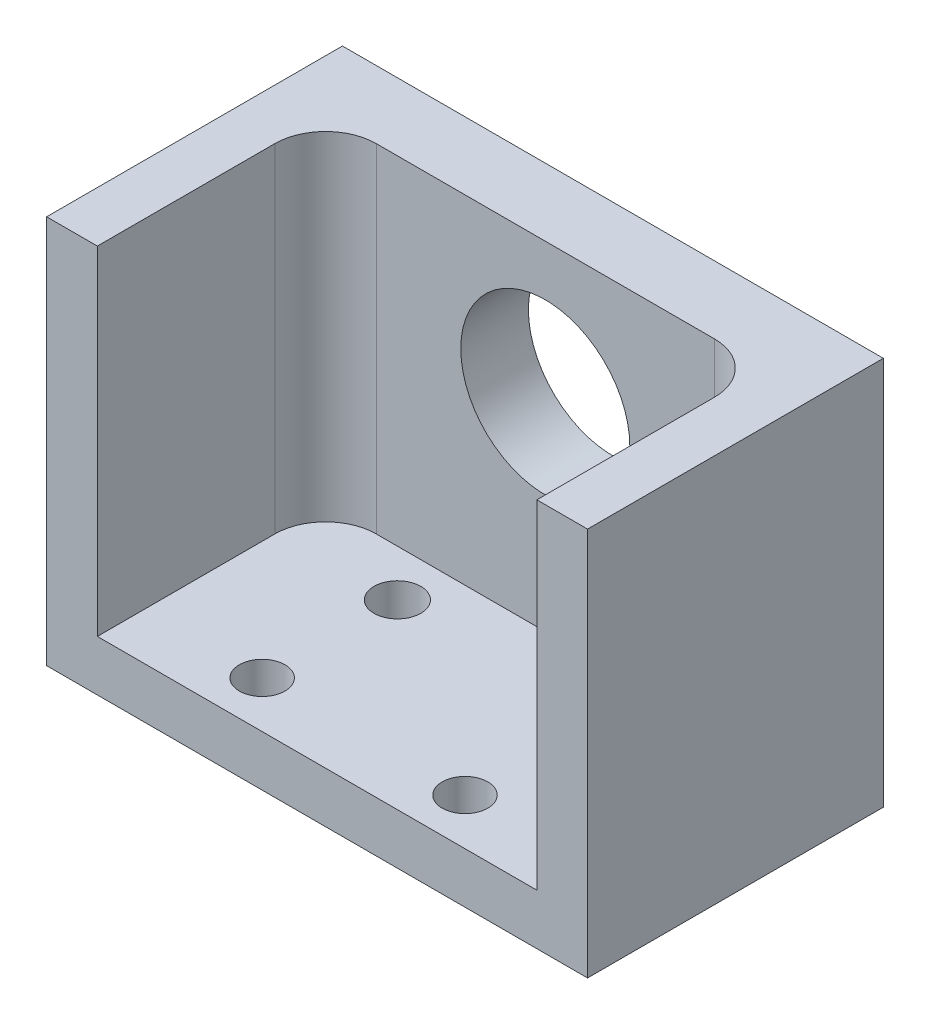
ISO-10303-21;
HEADER;
FILE_DESCRIPTION(('STEP AP214'),'2;1');
FILE_NAME('part.step','',(''),(''),'','','');
FILE_SCHEMA(('AUTOMOTIVE_DESIGN { 1 0 10303 214 1 1 1 1 }'));
ENDSEC;
DATA;
#1=APPLICATION_CONTEXT('core data for automotive mechanical design processes');
#2=APPLICATION_PROTOCOL_DEFINITION('international standard','automotive_design',2000,#1);
#3=PRODUCT_CONTEXT('',#1,'mechanical');
#4=PRODUCT('Part','Part','',(#3));
#5=PRODUCT_RELATED_PRODUCT_CATEGORY('part','',(#4));
#6=PRODUCT_DEFINITION_FORMATION('','',#4);
#7=PRODUCT_DEFINITION_CONTEXT('part definition',#1,'design');
#8=PRODUCT_DEFINITION('design','',#6,#7);
#9=PRODUCT_DEFINITION_SHAPE('','',#8);
#10=(LENGTH_UNIT() NAMED_UNIT(*) SI_UNIT(.MILLI.,.METRE.));
#11=(NAMED_UNIT(*) PLANE_ANGLE_UNIT() SI_UNIT($,.RADIAN.));
#12=(NAMED_UNIT(*) SI_UNIT($,.STERADIAN.) SOLID_ANGLE_UNIT());
#13=UNCERTAINTY_MEASURE_WITH_UNIT(LENGTH_MEASURE(1.E-05),#10,'distance_accuracy_value','');
#14=(GEOMETRIC_REPRESENTATION_CONTEXT(3) GLOBAL_UNCERTAINTY_ASSIGNED_CONTEXT((#13)) GLOBAL_UNIT_ASSIGNED_CONTEXT((#10,
#11,#12)) REPRESENTATION_CONTEXT('',''));
#15=CARTESIAN_POINT('',(0.,0.,0.));
#16=DIRECTION('',(0.,0.,1.));
#17=DIRECTION('',(1.,0.,0.));
#18=AXIS2_PLACEMENT_3D('',#15,#16,#17);
#19=CARTESIAN_POINT('',(0.,3.,0.));
#20=DIRECTION('',(0.,1.,0.));
#21=DIRECTION('',(0.,0.,1.));
#22=AXIS2_PLACEMENT_3D('',#19,#20,#21);
#23=PLANE('',#22);
#24=DIRECTION('',(1.,0.,0.));
#25=VECTOR('',#24,1.);
#26=CARTESIAN_POINT('',(-13.,3.,-4.75));
#27=LINE('',#26,#25);
#28=CARTESIAN_POINT('',(-10.,3.,-4.75));
#29=VERTEX_POINT('',#28);
#30=CARTESIAN_POINT('',(9.99999999999999,3.,-4.75));
#31=VERTEX_POINT('',#30);
#32=EDGE_CURVE('E171',#29,#31,#27,.T.);
#33=ORIENTED_EDGE('',*,*,#32,.F.);
#34=CARTESIAN_POINT('',(-10.,3.,-1.75));
#35=DIRECTION('',(0.,1.,0.));
#36=DIRECTION('',(0.,0.,1.));
#37=AXIS2_PLACEMENT_3D('',#34,#35,#36);
#38=CIRCLE('',#37,3.);
#39=CARTESIAN_POINT('',(-13.,3.,-1.75));
#40=VERTEX_POINT('',#39);
#41=EDGE_CURVE('E218',#29,#40,#38,.T.);
#42=ORIENTED_EDGE('',*,*,#41,.T.);
#43=DIRECTION('',(0.,0.,1.));
#44=VECTOR('',#43,1.);
#45=CARTESIAN_POINT('',(-13.,3.,-8.75));
#46=LINE('',#45,#44);
#47=CARTESIAN_POINT('',(-13.,3.,8.75));
#48=VERTEX_POINT('',#47);
#49=EDGE_CURVE('E204',#40,#48,#46,.T.);
#50=ORIENTED_EDGE('',*,*,#49,.T.);
#51=DIRECTION('',(1.,0.,0.));
#52=VECTOR('',#51,1.);
#53=CARTESIAN_POINT('',(-13.,3.,8.75));
#54=LINE('',#53,#52);
#55=CARTESIAN_POINT('',(13.,3.,8.75));
#56=VERTEX_POINT('',#55);
#57=EDGE_CURVE('E207',#48,#56,#54,.T.);
#58=ORIENTED_EDGE('',*,*,#57,.T.);
#59=DIRECTION('',(0.,0.,-1.));
#60=VECTOR('',#59,1.);
#61=CARTESIAN_POINT('',(13.,3.,-8.75));
#62=LINE('',#61,#60);
#63=CARTESIAN_POINT('',(13.,3.,-1.75));
#64=VERTEX_POINT('',#63);
#65=EDGE_CURVE('E135',#56,#64,#62,.T.);
#66=ORIENTED_EDGE('',*,*,#65,.T.);
#67=CARTESIAN_POINT('',(10.,3.,-1.75));
#68=DIRECTION('',(0.,1.,0.));
#69=DIRECTION('',(0.,0.,1.));
#70=AXIS2_PLACEMENT_3D('',#67,#68,#69);
#71=CIRCLE('',#70,3.);
#72=EDGE_CURVE('E216',#64,#31,#71,.T.);
#73=ORIENTED_EDGE('',*,*,#72,.T.);
#74=EDGE_LOOP('',(#33,#42,#50,#58,#66,#73));
#75=FACE_BOUND('',#74,.T.);
#76=CARTESIAN_POINT('',(6.,3.,-2.));
#77=DIRECTION('',(0.,1.,0.));
#78=DIRECTION('',(0.,0.,1.));
#79=AXIS2_PLACEMENT_3D('',#76,#77,#78);
#80=CIRCLE('',#79,1.35);
#81=CARTESIAN_POINT('',(6.,3.,-0.65));
#82=VERTEX_POINT('',#81);
#83=EDGE_CURVE('E185',#82,#82,#80,.T.);
#84=ORIENTED_EDGE('',*,*,#83,.F.);
#85=EDGE_LOOP('',(#84));
#86=FACE_BOUND('',#85,.T.);
#87=CARTESIAN_POINT('',(-6.,3.,6.));
#88=DIRECTION('',(0.,1.,0.));
#89=DIRECTION('',(0.,0.,1.));
#90=AXIS2_PLACEMENT_3D('',#87,#88,#89);
#91=CIRCLE('',#90,1.35);
#92=CARTESIAN_POINT('',(-6.,3.,7.35));
#93=VERTEX_POINT('',#92);
#94=EDGE_CURVE('E197',#93,#93,#91,.T.);
#95=ORIENTED_EDGE('',*,*,#94,.F.);
#96=EDGE_LOOP('',(#95));
#97=FACE_BOUND('',#96,.T.);
#98=CARTESIAN_POINT('',(-6.,3.,-2.));
#99=DIRECTION('',(0.,1.,0.));
#100=DIRECTION('',(0.,0.,1.));
#101=AXIS2_PLACEMENT_3D('',#98,#99,#100);
#102=CIRCLE('',#101,1.385);
#103=CARTESIAN_POINT('',(-6.,3.,-0.615));
#104=VERTEX_POINT('',#103);
#105=EDGE_CURVE('E191',#104,#104,#102,.T.);
#106=ORIENTED_EDGE('',*,*,#105,.F.);
#107=EDGE_LOOP('',(#106));
#108=FACE_BOUND('',#107,.T.);
#109=CARTESIAN_POINT('',(6.,3.,6.));
#110=DIRECTION('',(0.,1.,0.));
#111=DIRECTION('',(0.,0.,1.));
#112=AXIS2_PLACEMENT_3D('',#109,#110,#111);
#113=CIRCLE('',#112,1.35);
#114=CARTESIAN_POINT('',(6.,3.,7.35));
#115=VERTEX_POINT('',#114);
#116=EDGE_CURVE('E179',#115,#115,#113,.T.);
#117=ORIENTED_EDGE('',*,*,#116,.F.);
#118=EDGE_LOOP('',(#117));
#119=FACE_BOUND('',#118,.T.);
#120=ADVANCED_FACE('F36',(#75,#86,#97,#108,#119),#23,.T.);
#121=CARTESIAN_POINT('',(0.,0.,0.));
#122=DIRECTION('',(0.,1.,0.));
#123=DIRECTION('',(0.,0.,1.));
#124=AXIS2_PLACEMENT_3D('',#121,#122,#123);
#125=PLANE('',#124);
#126=DIRECTION('',(-1.,0.,0.));
#127=VECTOR('',#126,1.);
#128=CARTESIAN_POINT('',(-13.,0.,-8.75));
#129=LINE('',#128,#127);
#130=CARTESIAN_POINT('',(16.,0.,-8.75));
#131=VERTEX_POINT('',#130);
#132=CARTESIAN_POINT('',(-16.,0.,-8.75));
#133=VERTEX_POINT('',#132);
#134=EDGE_CURVE('E200',#131,#133,#129,.T.);
#135=ORIENTED_EDGE('',*,*,#134,.F.);
#136=DIRECTION('',(0.,0.,-1.));
#137=VECTOR('',#136,1.);
#138=CARTESIAN_POINT('',(16.,0.,-8.75));
#139=LINE('',#138,#137);
#140=CARTESIAN_POINT('',(16.,0.,8.75));
#141=VERTEX_POINT('',#140);
#142=EDGE_CURVE('E151',#141,#131,#139,.T.);
#143=ORIENTED_EDGE('',*,*,#142,.F.);
#144=DIRECTION('',(1.,0.,0.));
#145=VECTOR('',#144,1.);
#146=CARTESIAN_POINT('',(-13.,0.,8.75));
#147=LINE('',#146,#145);
#148=CARTESIAN_POINT('',(-16.,0.,8.75));
#149=VERTEX_POINT('',#148);
#150=EDGE_CURVE('E205',#149,#141,#147,.T.);
#151=ORIENTED_EDGE('',*,*,#150,.F.);
#152=DIRECTION('',(0.,0.,1.));
#153=VECTOR('',#152,1.);
#154=CARTESIAN_POINT('',(-16.,0.,-8.75));
#155=LINE('',#154,#153);
#156=EDGE_CURVE('E160',#133,#149,#155,.T.);
#157=ORIENTED_EDGE('',*,*,#156,.F.);
#158=EDGE_LOOP('',(#135,#143,#151,#157));
#159=FACE_BOUND('',#158,.T.);
#160=CARTESIAN_POINT('',(-6.,0.,6.));
#161=DIRECTION('',(0.,1.,0.));
#162=DIRECTION('',(0.,0.,1.));
#163=AXIS2_PLACEMENT_3D('',#160,#161,#162);
#164=CIRCLE('',#163,1.35);
#165=CARTESIAN_POINT('',(-6.,0.,7.35));
#166=VERTEX_POINT('',#165);
#167=EDGE_CURVE('E194',#166,#166,#164,.T.);
#168=ORIENTED_EDGE('',*,*,#167,.T.);
#169=EDGE_LOOP('',(#168));
#170=FACE_BOUND('',#169,.T.);
#171=CARTESIAN_POINT('',(-6.,0.,-2.));
#172=DIRECTION('',(0.,1.,0.));
#173=DIRECTION('',(0.,0.,1.));
#174=AXIS2_PLACEMENT_3D('',#171,#172,#173);
#175=CIRCLE('',#174,1.385);
#176=CARTESIAN_POINT('',(-6.,0.,-0.615));
#177=VERTEX_POINT('',#176);
#178=EDGE_CURVE('E188',#177,#177,#175,.T.);
#179=ORIENTED_EDGE('',*,*,#178,.T.);
#180=EDGE_LOOP('',(#179));
#181=FACE_BOUND('',#180,.T.);
#182=CARTESIAN_POINT('',(6.,0.,-2.));
#183=DIRECTION('',(0.,1.,0.));
#184=DIRECTION('',(0.,0.,1.));
#185=AXIS2_PLACEMENT_3D('',#182,#183,#184);
#186=CIRCLE('',#185,1.35);
#187=CARTESIAN_POINT('',(6.,0.,-0.65));
#188=VERTEX_POINT('',#187);
#189=EDGE_CURVE('E182',#188,#188,#186,.T.);
#190=ORIENTED_EDGE('',*,*,#189,.T.);
#191=EDGE_LOOP('',(#190));
#192=FACE_BOUND('',#191,.T.);
#193=CARTESIAN_POINT('',(6.,0.,6.));
#194=DIRECTION('',(0.,1.,0.));
#195=DIRECTION('',(0.,0.,1.));
#196=AXIS2_PLACEMENT_3D('',#193,#194,#195);
#197=CIRCLE('',#196,1.35);
#198=CARTESIAN_POINT('',(6.,0.,7.35));
#199=VERTEX_POINT('',#198);
#200=EDGE_CURVE('E176',#199,#199,#197,.T.);
#201=ORIENTED_EDGE('',*,*,#200,.T.);
#202=EDGE_LOOP('',(#201));
#203=FACE_BOUND('',#202,.T.);
#204=ADVANCED_FACE('F242',(#159,#170,#181,#192,#203),#125,.F.);
#205=CARTESIAN_POINT('',(-13.,3.,-8.75));
#206=DIRECTION('',(0.,0.,1.));
#207=DIRECTION('',(1.,0.,0.));
#208=AXIS2_PLACEMENT_3D('',#205,#206,#207);
#209=PLANE('',#208);
#210=CARTESIAN_POINT('',(0.,15.,-8.75));
#211=DIRECTION('',(0.,0.,1.));
#212=DIRECTION('',(1.,0.,0.));
#213=AXIS2_PLACEMENT_3D('',#210,#211,#212);
#214=CIRCLE('',#213,5.);
#215=CARTESIAN_POINT('',(5.,15.,-8.75));
#216=VERTEX_POINT('',#215);
#217=EDGE_CURVE('E168',#216,#216,#214,.T.);
#218=ORIENTED_EDGE('',*,*,#217,.T.);
#219=EDGE_LOOP('',(#218));
#220=FACE_BOUND('',#219,.T.);
#221=ORIENTED_EDGE('',*,*,#134,.T.);
#222=DIRECTION('',(0.,-1.,0.));
#223=VECTOR('',#222,1.);
#224=CARTESIAN_POINT('',(-16.,23.,-8.75));
#225=LINE('',#224,#223);
#226=CARTESIAN_POINT('',(-16.,23.,-8.75));
#227=VERTEX_POINT('',#226);
#228=EDGE_CURVE('E157',#227,#133,#225,.T.);
#229=ORIENTED_EDGE('',*,*,#228,.F.);
#230=DIRECTION('',(-1.,0.,0.));
#231=VECTOR('',#230,1.);
#232=CARTESIAN_POINT('',(-13.,23.,-8.75));
#233=LINE('',#232,#231);
#234=CARTESIAN_POINT('',(16.,23.,-8.75));
#235=VERTEX_POINT('',#234);
#236=EDGE_CURVE('E174',#235,#227,#233,.T.);
#237=ORIENTED_EDGE('',*,*,#236,.F.);
#238=DIRECTION('',(0.,1.,0.));
#239=VECTOR('',#238,1.);
#240=CARTESIAN_POINT('',(16.,23.,-8.75));
#241=LINE('',#240,#239);
#242=EDGE_CURVE('E145',#131,#235,#241,.T.);
#243=ORIENTED_EDGE('',*,*,#242,.F.);
#244=EDGE_LOOP('',(#221,#229,#237,#243));
#245=FACE_BOUND('',#244,.T.);
#246=ADVANCED_FACE('F249',(#220,#245),#209,.F.);
#247=CARTESIAN_POINT('',(-13.,3.,8.75));
#248=DIRECTION('',(0.,0.,-1.));
#249=DIRECTION('',(-1.,0.,0.));
#250=AXIS2_PLACEMENT_3D('',#247,#248,#249);
#251=PLANE('',#250);
#252=ORIENTED_EDGE('',*,*,#150,.T.);
#253=DIRECTION('',(0.,-1.,0.));
#254=VECTOR('',#253,1.);
#255=CARTESIAN_POINT('',(16.,0.,8.75));
#256=LINE('',#255,#254);
#257=CARTESIAN_POINT('',(16.,23.,8.75));
#258=VERTEX_POINT('',#257);
#259=EDGE_CURVE('E129',#258,#141,#256,.T.);
#260=ORIENTED_EDGE('',*,*,#259,.F.);
#261=DIRECTION('',(1.,0.,0.));
#262=VECTOR('',#261,1.);
#263=CARTESIAN_POINT('',(13.,23.,8.75));
#264=LINE('',#263,#262);
#265=CARTESIAN_POINT('',(13.,23.,8.75));
#266=VERTEX_POINT('',#265);
#267=EDGE_CURVE('E116',#266,#258,#264,.T.);
#268=ORIENTED_EDGE('',*,*,#267,.F.);
#269=DIRECTION('',(0.,-1.,0.));
#270=VECTOR('',#269,1.);
#271=CARTESIAN_POINT('',(13.,3.,8.75));
#272=LINE('',#271,#270);
#273=EDGE_CURVE('E121',#266,#56,#272,.T.);
#274=ORIENTED_EDGE('',*,*,#273,.T.);
#275=ORIENTED_EDGE('',*,*,#57,.F.);
#276=DIRECTION('',(0.,1.,0.));
#277=VECTOR('',#276,1.);
#278=CARTESIAN_POINT('',(-13.,23.,8.75));
#279=LINE('',#278,#277);
#280=CARTESIAN_POINT('',(-13.,23.,8.75));
#281=VERTEX_POINT('',#280);
#282=EDGE_CURVE('E130',#48,#281,#279,.T.);
#283=ORIENTED_EDGE('',*,*,#282,.T.);
#284=DIRECTION('',(-1.,0.,0.));
#285=VECTOR('',#284,1.);
#286=CARTESIAN_POINT('',(-13.,23.,8.75));
#287=LINE('',#286,#285);
#288=CARTESIAN_POINT('',(-16.,23.,8.75));
#289=VERTEX_POINT('',#288);
#290=EDGE_CURVE('E142',#281,#289,#287,.T.);
#291=ORIENTED_EDGE('',*,*,#290,.T.);
#292=DIRECTION('',(0.,1.,0.));
#293=VECTOR('',#292,1.);
#294=CARTESIAN_POINT('',(-16.,0.,8.75));
#295=LINE('',#294,#293);
#296=EDGE_CURVE('E163',#149,#289,#295,.T.);
#297=ORIENTED_EDGE('',*,*,#296,.F.);
#298=EDGE_LOOP('',(#252,#260,#268,#274,#275,#283,#291,#297));
#299=FACE_BOUND('',#298,.T.);
#300=ADVANCED_FACE('F126',(#299),#251,.F.);
#301=CARTESIAN_POINT('',(-6.,3.,6.));
#302=DIRECTION('',(0.,-1.,0.));
#303=DIRECTION('',(0.,0.,-1.));
#304=AXIS2_PLACEMENT_3D('',#301,#302,#303);
#305=CYLINDRICAL_SURFACE('',#304,1.35);
#306=ORIENTED_EDGE('',*,*,#94,.T.);
#307=EDGE_LOOP('',(#306));
#308=FACE_BOUND('',#307,.T.);
#309=ORIENTED_EDGE('',*,*,#167,.F.);
#310=EDGE_LOOP('',(#309));
#311=FACE_BOUND('',#310,.T.);
#312=ADVANCED_FACE('F253',(#308,#311),#305,.F.);
#313=CARTESIAN_POINT('',(-6.,3.,-2.));
#314=DIRECTION('',(0.,-1.,0.));
#315=DIRECTION('',(0.,0.,-1.));
#316=AXIS2_PLACEMENT_3D('',#313,#314,#315);
#317=CYLINDRICAL_SURFACE('',#316,1.385);
#318=ORIENTED_EDGE('',*,*,#105,.T.);
#319=EDGE_LOOP('',(#318));
#320=FACE_BOUND('',#319,.T.);
#321=ORIENTED_EDGE('',*,*,#178,.F.);
#322=EDGE_LOOP('',(#321));
#323=FACE_BOUND('',#322,.T.);
#324=ADVANCED_FACE('F300',(#320,#323),#317,.F.);
#325=CARTESIAN_POINT('',(6.,3.,-2.));
#326=DIRECTION('',(0.,-1.,0.));
#327=DIRECTION('',(0.,0.,-1.));
#328=AXIS2_PLACEMENT_3D('',#325,#326,#327);
#329=CYLINDRICAL_SURFACE('',#328,1.35);
#330=ORIENTED_EDGE('',*,*,#83,.T.);
#331=EDGE_LOOP('',(#330));
#332=FACE_BOUND('',#331,.T.);
#333=ORIENTED_EDGE('',*,*,#189,.F.);
#334=EDGE_LOOP('',(#333));
#335=FACE_BOUND('',#334,.T.);
#336=ADVANCED_FACE('F297',(#332,#335),#329,.F.);
#337=CARTESIAN_POINT('',(6.,3.,6.));
#338=DIRECTION('',(0.,-1.,0.));
#339=DIRECTION('',(0.,0.,-1.));
#340=AXIS2_PLACEMENT_3D('',#337,#338,#339);
#341=CYLINDRICAL_SURFACE('',#340,1.35);
#342=ORIENTED_EDGE('',*,*,#116,.T.);
#343=EDGE_LOOP('',(#342));
#344=FACE_BOUND('',#343,.T.);
#345=ORIENTED_EDGE('',*,*,#200,.F.);
#346=EDGE_LOOP('',(#345));
#347=FACE_BOUND('',#346,.T.);
#348=ADVANCED_FACE('F293',(#344,#347),#341,.F.);
#349=CARTESIAN_POINT('',(-13.,23.,-4.75));
#350=DIRECTION('',(0.,0.,-1.));
#351=DIRECTION('',(-1.,0.,0.));
#352=AXIS2_PLACEMENT_3D('',#349,#350,#351);
#353=PLANE('',#352);
#354=CARTESIAN_POINT('',(0.,15.,-4.75));
#355=DIRECTION('',(0.,0.,1.));
#356=DIRECTION('',(1.,0.,0.));
#357=AXIS2_PLACEMENT_3D('',#354,#355,#356);
#358=CIRCLE('',#357,5.);
#359=CARTESIAN_POINT('',(5.,15.,-4.75));
#360=VERTEX_POINT('',#359);
#361=EDGE_CURVE('E165',#360,#360,#358,.T.);
#362=ORIENTED_EDGE('',*,*,#361,.F.);
#363=EDGE_LOOP('',(#362));
#364=FACE_BOUND('',#363,.T.);
#365=DIRECTION('',(1.,0.,0.));
#366=VECTOR('',#365,1.);
#367=CARTESIAN_POINT('',(-13.,23.,-4.75));
#368=LINE('',#367,#366);
#369=CARTESIAN_POINT('',(-10.,23.,-4.75));
#370=VERTEX_POINT('',#369);
#371=CARTESIAN_POINT('',(9.99999999999999,23.,-4.75));
#372=VERTEX_POINT('',#371);
#373=EDGE_CURVE('E172',#370,#372,#368,.T.);
#374=ORIENTED_EDGE('',*,*,#373,.F.);
#375=DIRECTION('',(0.,-1.,0.));
#376=VECTOR('',#375,1.);
#377=CARTESIAN_POINT('',(-10.,3.,-4.75));
#378=LINE('',#377,#376);
#379=EDGE_CURVE('E213',#370,#29,#378,.T.);
#380=ORIENTED_EDGE('',*,*,#379,.T.);
#381=ORIENTED_EDGE('',*,*,#32,.T.);
#382=DIRECTION('',(0.,-1.,0.));
#383=VECTOR('',#382,1.);
#384=CARTESIAN_POINT('',(10.,23.,-4.75));
#385=LINE('',#384,#383);
#386=EDGE_CURVE('E209',#31,#372,#385,.F.);
#387=ORIENTED_EDGE('',*,*,#386,.T.);
#388=EDGE_LOOP('',(#374,#380,#381,#387));
#389=FACE_BOUND('',#388,.T.);
#390=ADVANCED_FACE('F227',(#364,#389),#353,.F.);
#391=CARTESIAN_POINT('',(0.,23.,0.));
#392=DIRECTION('',(0.,1.,0.));
#393=DIRECTION('',(0.,0.,1.));
#394=AXIS2_PLACEMENT_3D('',#391,#392,#393);
#395=PLANE('',#394);
#396=ORIENTED_EDGE('',*,*,#236,.T.);
#397=DIRECTION('',(0.,0.,-1.));
#398=VECTOR('',#397,1.);
#399=CARTESIAN_POINT('',(-16.,23.,-4.75));
#400=LINE('',#399,#398);
#401=EDGE_CURVE('E154',#289,#227,#400,.T.);
#402=ORIENTED_EDGE('',*,*,#401,.F.);
#403=ORIENTED_EDGE('',*,*,#290,.F.);
#404=DIRECTION('',(0.,0.,-1.));
#405=VECTOR('',#404,1.);
#406=CARTESIAN_POINT('',(-13.,23.,-4.75));
#407=LINE('',#406,#405);
#408=CARTESIAN_POINT('',(-13.,23.,-1.75));
#409=VERTEX_POINT('',#408);
#410=EDGE_CURVE('E140',#281,#409,#407,.T.);
#411=ORIENTED_EDGE('',*,*,#410,.T.);
#412=CARTESIAN_POINT('',(-10.,23.,-1.75));
#413=DIRECTION('',(0.,1.,0.));
#414=DIRECTION('',(0.,0.,1.));
#415=AXIS2_PLACEMENT_3D('',#412,#413,#414);
#416=CIRCLE('',#415,3.);
#417=EDGE_CURVE('E44',#409,#370,#416,.F.);
#418=ORIENTED_EDGE('',*,*,#417,.T.);
#419=ORIENTED_EDGE('',*,*,#373,.T.);
#420=CARTESIAN_POINT('',(10.,23.,-1.75));
#421=DIRECTION('',(0.,1.,0.));
#422=DIRECTION('',(0.,0.,1.));
#423=AXIS2_PLACEMENT_3D('',#420,#421,#422);
#424=CIRCLE('',#423,3.);
#425=CARTESIAN_POINT('',(13.,23.,-1.75));
#426=VERTEX_POINT('',#425);
#427=EDGE_CURVE('E11',#372,#426,#424,.F.);
#428=ORIENTED_EDGE('',*,*,#427,.T.);
#429=DIRECTION('',(0.,0.,1.));
#430=VECTOR('',#429,1.);
#431=CARTESIAN_POINT('',(13.,23.,8.75));
#432=LINE('',#431,#430);
#433=EDGE_CURVE('E112',#426,#266,#432,.T.);
#434=ORIENTED_EDGE('',*,*,#433,.T.);
#435=ORIENTED_EDGE('',*,*,#267,.T.);
#436=DIRECTION('',(0.,0.,1.));
#437=VECTOR('',#436,1.);
#438=CARTESIAN_POINT('',(16.,23.,-4.75));
#439=LINE('',#438,#437);
#440=EDGE_CURVE('E148',#235,#258,#439,.T.);
#441=ORIENTED_EDGE('',*,*,#440,.F.);
#442=EDGE_LOOP('',(#396,#402,#403,#411,#418,#419,#428,#434,#435,#441));
#443=FACE_BOUND('',#442,.T.);
#444=ADVANCED_FACE('F114',(#443),#395,.T.);
#445=CARTESIAN_POINT('',(0.,15.,-24.75));
#446=DIRECTION('',(0.,0.,1.));
#447=DIRECTION('',(1.,0.,0.));
#448=AXIS2_PLACEMENT_3D('',#445,#446,#447);
#449=CYLINDRICAL_SURFACE('',#448,5.);
#450=ORIENTED_EDGE('',*,*,#361,.T.);
#451=EDGE_LOOP('',(#450));
#452=FACE_BOUND('',#451,.T.);
#453=ORIENTED_EDGE('',*,*,#217,.F.);
#454=EDGE_LOOP('',(#453));
#455=FACE_BOUND('',#454,.T.);
#456=ADVANCED_FACE('F285',(#452,#455),#449,.F.);
#457=CARTESIAN_POINT('',(-16.,0.,0.));
#458=DIRECTION('',(-1.,0.,0.));
#459=DIRECTION('',(0.,0.,1.));
#460=AXIS2_PLACEMENT_3D('',#457,#458,#459);
#461=PLANE('',#460);
#462=ORIENTED_EDGE('',*,*,#401,.T.);
#463=ORIENTED_EDGE('',*,*,#228,.T.);
#464=ORIENTED_EDGE('',*,*,#156,.T.);
#465=ORIENTED_EDGE('',*,*,#296,.T.);
#466=EDGE_LOOP('',(#462,#463,#464,#465));
#467=FACE_BOUND('',#466,.T.);
#468=ADVANCED_FACE('F269',(#467),#461,.T.);
#469=CARTESIAN_POINT('',(-13.,0.,0.));
#470=DIRECTION('',(-1.,0.,0.));
#471=DIRECTION('',(0.,0.,1.));
#472=AXIS2_PLACEMENT_3D('',#469,#470,#471);
#473=PLANE('',#472);
#474=ORIENTED_EDGE('',*,*,#49,.F.);
#475=DIRECTION('',(0.,-1.,0.));
#476=VECTOR('',#475,1.);
#477=CARTESIAN_POINT('',(-13.,23.,-1.75));
#478=LINE('',#477,#476);
#479=EDGE_CURVE('E57',#40,#409,#478,.F.);
#480=ORIENTED_EDGE('',*,*,#479,.T.);
#481=ORIENTED_EDGE('',*,*,#410,.F.);
#482=ORIENTED_EDGE('',*,*,#282,.F.);
#483=EDGE_LOOP('',(#474,#480,#481,#482));
#484=FACE_BOUND('',#483,.T.);
#485=ADVANCED_FACE('F234',(#484),#473,.F.);
#486=CARTESIAN_POINT('',(16.,0.,0.));
#487=DIRECTION('',(-1.,0.,0.));
#488=DIRECTION('',(0.,0.,1.));
#489=AXIS2_PLACEMENT_3D('',#486,#487,#488);
#490=PLANE('',#489);
#491=ORIENTED_EDGE('',*,*,#242,.T.);
#492=ORIENTED_EDGE('',*,*,#440,.T.);
#493=ORIENTED_EDGE('',*,*,#259,.T.);
#494=ORIENTED_EDGE('',*,*,#142,.T.);
#495=EDGE_LOOP('',(#491,#492,#493,#494));
#496=FACE_BOUND('',#495,.T.);
#497=ADVANCED_FACE('F273',(#496),#490,.F.);
#498=CARTESIAN_POINT('',(13.,0.,0.));
#499=DIRECTION('',(-1.,0.,0.));
#500=DIRECTION('',(0.,0.,1.));
#501=AXIS2_PLACEMENT_3D('',#498,#499,#500);
#502=PLANE('',#501);
#503=ORIENTED_EDGE('',*,*,#433,.F.);
#504=DIRECTION('',(0.,-1.,0.));
#505=VECTOR('',#504,1.);
#506=CARTESIAN_POINT('',(13.,0.,-1.75));
#507=LINE('',#506,#505);
#508=EDGE_CURVE('E221',#426,#64,#507,.T.);
#509=ORIENTED_EDGE('',*,*,#508,.T.);
#510=ORIENTED_EDGE('',*,*,#65,.F.);
#511=ORIENTED_EDGE('',*,*,#273,.F.);
#512=EDGE_LOOP('',(#503,#509,#510,#511));
#513=FACE_BOUND('',#512,.T.);
#514=ADVANCED_FACE('F133',(#513),#502,.T.);
#515=CARTESIAN_POINT('',(-10.,23.,-1.75));
#516=DIRECTION('',(0.,1.,0.));
#517=DIRECTION('',(0.,0.,1.));
#518=AXIS2_PLACEMENT_3D('',#515,#516,#517);
#519=CYLINDRICAL_SURFACE('',#518,3.);
#520=ORIENTED_EDGE('',*,*,#417,.F.);
#521=ORIENTED_EDGE('',*,*,#479,.F.);
#522=ORIENTED_EDGE('',*,*,#41,.F.);
#523=ORIENTED_EDGE('',*,*,#379,.F.);
#524=EDGE_LOOP('',(#520,#521,#522,#523));
#525=FACE_BOUND('',#524,.T.);
#526=ADVANCED_FACE('F230',(#525),#519,.F.);
#527=CARTESIAN_POINT('',(10.,0.,-1.75));
#528=DIRECTION('',(0.,-1.,0.));
#529=DIRECTION('',(0.,0.,-1.));
#530=AXIS2_PLACEMENT_3D('',#527,#528,#529);
#531=CYLINDRICAL_SURFACE('',#530,3.);
#532=ORIENTED_EDGE('',*,*,#427,.F.);
#533=ORIENTED_EDGE('',*,*,#386,.F.);
#534=ORIENTED_EDGE('',*,*,#72,.F.);
#535=ORIENTED_EDGE('',*,*,#508,.F.);
#536=EDGE_LOOP('',(#532,#533,#534,#535));
#537=FACE_BOUND('',#536,.T.);
#538=ADVANCED_FACE('F38',(#537),#531,.F.);
#539=CLOSED_SHELL('',(#120,#204,#246,#300,#312,#324,#336,#348,#390,#444,#456,#468,#485,#497,
#514,#526,#538));
#540=MANIFOLD_SOLID_BREP('B2',#539);
#541=ADVANCED_BREP_SHAPE_REPRESENTATION('',(#18,#540),#14);
#542=SHAPE_DEFINITION_REPRESENTATION(#9,#541);
ENDSEC;
END-ISO-10303-21;
